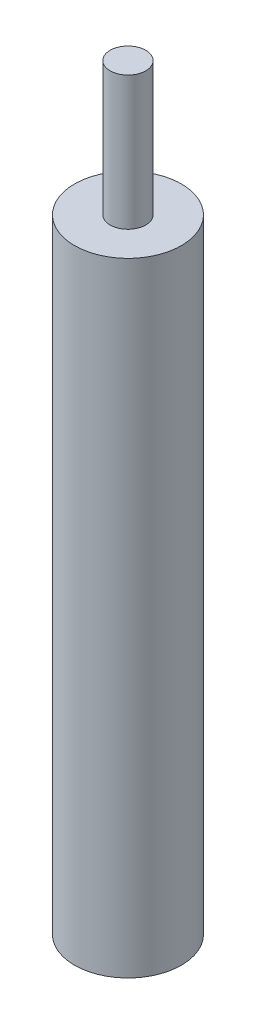
ISO-10303-21;
HEADER;
FILE_DESCRIPTION(('STEP AP214'),'2;1');
FILE_NAME('part.step','',(''),(''),'','','');
FILE_SCHEMA(('AUTOMOTIVE_DESIGN { 1 0 10303 214 1 1 1 1 }'));
ENDSEC;
DATA;
#1=APPLICATION_CONTEXT('core data for automotive mechanical design processes');
#2=APPLICATION_PROTOCOL_DEFINITION('international standard','automotive_design',2000,#1);
#3=PRODUCT_CONTEXT('',#1,'mechanical');
#4=PRODUCT('Part','Part','',(#3));
#5=PRODUCT_RELATED_PRODUCT_CATEGORY('part','',(#4));
#6=PRODUCT_DEFINITION_FORMATION('','',#4);
#7=PRODUCT_DEFINITION_CONTEXT('part definition',#1,'design');
#8=PRODUCT_DEFINITION('design','',#6,#7);
#9=PRODUCT_DEFINITION_SHAPE('','',#8);
#10=(LENGTH_UNIT() NAMED_UNIT(*) SI_UNIT(.MILLI.,.METRE.));
#11=(NAMED_UNIT(*) PLANE_ANGLE_UNIT() SI_UNIT($,.RADIAN.));
#12=(NAMED_UNIT(*) SI_UNIT($,.STERADIAN.) SOLID_ANGLE_UNIT());
#13=UNCERTAINTY_MEASURE_WITH_UNIT(LENGTH_MEASURE(1.E-05),#10,'distance_accuracy_value','');
#14=(GEOMETRIC_REPRESENTATION_CONTEXT(3) GLOBAL_UNCERTAINTY_ASSIGNED_CONTEXT((#13)) GLOBAL_UNIT_ASSIGNED_CONTEXT((#10,
#11,#12)) REPRESENTATION_CONTEXT('',''));
#15=CARTESIAN_POINT('',(0.,0.,0.));
#16=DIRECTION('',(0.,0.,1.));
#17=DIRECTION('',(1.,0.,0.));
#18=AXIS2_PLACEMENT_3D('',#15,#16,#17);
#19=CARTESIAN_POINT('',(0.,70.,0.));
#20=DIRECTION('',(0.,-1.,0.));
#21=DIRECTION('',(0.,0.,-1.));
#22=AXIS2_PLACEMENT_3D('',#19,#20,#21);
#23=CYLINDRICAL_SURFACE('',#22,6.);
#24=CARTESIAN_POINT('',(0.,70.,0.));
#25=DIRECTION('',(0.,1.,0.));
#26=DIRECTION('',(0.,0.,1.));
#27=AXIS2_PLACEMENT_3D('',#24,#25,#26);
#28=CIRCLE('',#27,6.);
#29=CARTESIAN_POINT('',(0.,70.,6.));
#30=VERTEX_POINT('',#29);
#31=EDGE_CURVE('E48',#30,#30,#28,.T.);
#32=ORIENTED_EDGE('',*,*,#31,.F.);
#33=EDGE_LOOP('',(#32));
#34=FACE_BOUND('',#33,.T.);
#35=CARTESIAN_POINT('',(0.,0.,0.));
#36=DIRECTION('',(0.,1.,0.));
#37=DIRECTION('',(0.,0.,1.));
#38=AXIS2_PLACEMENT_3D('',#35,#36,#37);
#39=CIRCLE('',#38,6.);
#40=CARTESIAN_POINT('',(0.,0.,6.));
#41=VERTEX_POINT('',#40);
#42=EDGE_CURVE('E42',#41,#41,#39,.T.);
#43=ORIENTED_EDGE('',*,*,#42,.T.);
#44=EDGE_LOOP('',(#43));
#45=FACE_BOUND('',#44,.T.);
#46=ADVANCED_FACE('F41',(#34,#45),#23,.T.);
#47=CARTESIAN_POINT('',(0.,70.,0.));
#48=DIRECTION('',(0.,1.,0.));
#49=DIRECTION('',(0.,0.,1.));
#50=AXIS2_PLACEMENT_3D('',#47,#48,#49);
#51=PLANE('',#50);
#52=CARTESIAN_POINT('',(0.,70.,0.));
#53=DIRECTION('',(0.,1.,0.));
#54=DIRECTION('',(0.,0.,1.));
#55=AXIS2_PLACEMENT_3D('',#52,#53,#54);
#56=CIRCLE('',#55,2.);
#57=CARTESIAN_POINT('',(0.,70.,2.));
#58=VERTEX_POINT('',#57);
#59=EDGE_CURVE('E10',#58,#58,#56,.T.);
#60=ORIENTED_EDGE('',*,*,#59,.F.);
#61=EDGE_LOOP('',(#60));
#62=FACE_BOUND('',#61,.T.);
#63=ORIENTED_EDGE('',*,*,#31,.T.);
#64=EDGE_LOOP('',(#63));
#65=FACE_BOUND('',#64,.T.);
#66=ADVANCED_FACE('F86',(#62,#65),#51,.T.);
#67=CARTESIAN_POINT('',(0.,0.,0.));
#68=DIRECTION('',(0.,1.,0.));
#69=DIRECTION('',(0.,0.,1.));
#70=AXIS2_PLACEMENT_3D('',#67,#68,#69);
#71=PLANE('',#70);
#72=CARTESIAN_POINT('',(-2.5,0.,0.));
#73=DIRECTION('',(0.,1.,0.));
#74=DIRECTION('',(0.,0.,1.));
#75=AXIS2_PLACEMENT_3D('',#72,#73,#74);
#76=CIRCLE('',#75,0.8);
#77=CARTESIAN_POINT('',(-2.5,0.,0.8));
#78=VERTEX_POINT('',#77);
#79=EDGE_CURVE('E56',#78,#78,#76,.T.);
#80=ORIENTED_EDGE('',*,*,#79,.T.);
#81=EDGE_LOOP('',(#80));
#82=FACE_BOUND('',#81,.T.);
#83=CARTESIAN_POINT('',(2.5,0.,0.));
#84=DIRECTION('',(0.,1.,0.));
#85=DIRECTION('',(0.,0.,1.));
#86=AXIS2_PLACEMENT_3D('',#83,#84,#85);
#87=CIRCLE('',#86,0.8);
#88=CARTESIAN_POINT('',(2.5,0.,0.8));
#89=VERTEX_POINT('',#88);
#90=EDGE_CURVE('E64',#89,#89,#87,.T.);
#91=ORIENTED_EDGE('',*,*,#90,.T.);
#92=EDGE_LOOP('',(#91));
#93=FACE_BOUND('',#92,.T.);
#94=ORIENTED_EDGE('',*,*,#42,.F.);
#95=EDGE_LOOP('',(#94));
#96=FACE_BOUND('',#95,.T.);
#97=ADVANCED_FACE('F91',(#82,#93,#96),#71,.F.);
#98=CARTESIAN_POINT('',(2.5,3.,0.));
#99=DIRECTION('',(0.,-1.,0.));
#100=DIRECTION('',(0.,0.,-1.));
#101=AXIS2_PLACEMENT_3D('',#98,#99,#100);
#102=CYLINDRICAL_SURFACE('',#101,0.8);
#103=CARTESIAN_POINT('',(2.5,3.,0.));
#104=DIRECTION('',(0.,1.,0.));
#105=DIRECTION('',(0.,0.,1.));
#106=AXIS2_PLACEMENT_3D('',#103,#104,#105);
#107=CIRCLE('',#106,0.8);
#108=CARTESIAN_POINT('',(2.5,3.,0.8));
#109=VERTEX_POINT('',#108);
#110=EDGE_CURVE('E63',#109,#109,#107,.T.);
#111=ORIENTED_EDGE('',*,*,#110,.T.);
#112=EDGE_LOOP('',(#111));
#113=FACE_BOUND('',#112,.T.);
#114=ORIENTED_EDGE('',*,*,#90,.F.);
#115=EDGE_LOOP('',(#114));
#116=FACE_BOUND('',#115,.T.);
#117=ADVANCED_FACE('F101',(#113,#116),#102,.F.);
#118=CARTESIAN_POINT('',(2.5,3.,0.));
#119=DIRECTION('',(0.,1.,0.));
#120=DIRECTION('',(0.,0.,1.));
#121=AXIS2_PLACEMENT_3D('',#118,#119,#120);
#122=PLANE('',#121);
#123=ORIENTED_EDGE('',*,*,#110,.F.);
#124=EDGE_LOOP('',(#123));
#125=FACE_BOUND('',#124,.T.);
#126=ADVANCED_FACE('F106',(#125),#122,.F.);
#127=CARTESIAN_POINT('',(-2.5,3.,0.));
#128=DIRECTION('',(0.,-1.,0.));
#129=DIRECTION('',(0.,0.,-1.));
#130=AXIS2_PLACEMENT_3D('',#127,#128,#129);
#131=CYLINDRICAL_SURFACE('',#130,0.8);
#132=CARTESIAN_POINT('',(-2.5,3.,0.));
#133=DIRECTION('',(0.,1.,0.));
#134=DIRECTION('',(0.,0.,1.));
#135=AXIS2_PLACEMENT_3D('',#132,#133,#134);
#136=CIRCLE('',#135,0.8);
#137=CARTESIAN_POINT('',(-2.5,3.,0.8));
#138=VERTEX_POINT('',#137);
#139=EDGE_CURVE('E57',#138,#138,#136,.T.);
#140=ORIENTED_EDGE('',*,*,#139,.T.);
#141=EDGE_LOOP('',(#140));
#142=FACE_BOUND('',#141,.T.);
#143=ORIENTED_EDGE('',*,*,#79,.F.);
#144=EDGE_LOOP('',(#143));
#145=FACE_BOUND('',#144,.T.);
#146=ADVANCED_FACE('F83',(#142,#145),#131,.F.);
#147=CARTESIAN_POINT('',(-2.5,3.,0.));
#148=DIRECTION('',(0.,1.,0.));
#149=DIRECTION('',(0.,0.,1.));
#150=AXIS2_PLACEMENT_3D('',#147,#148,#149);
#151=PLANE('',#150);
#152=ORIENTED_EDGE('',*,*,#139,.F.);
#153=EDGE_LOOP('',(#152));
#154=FACE_BOUND('',#153,.T.);
#155=ADVANCED_FACE('F77',(#154),#151,.F.);
#156=CARTESIAN_POINT('',(0.,85.,0.));
#157=DIRECTION('',(0.,-1.,0.));
#158=DIRECTION('',(0.,0.,-1.));
#159=AXIS2_PLACEMENT_3D('',#156,#157,#158);
#160=CYLINDRICAL_SURFACE('',#159,2.);
#161=CARTESIAN_POINT('',(0.,85.,0.));
#162=DIRECTION('',(0.,1.,0.));
#163=DIRECTION('',(0.,0.,1.));
#164=AXIS2_PLACEMENT_3D('',#161,#162,#163);
#165=CIRCLE('',#164,2.);
#166=CARTESIAN_POINT('',(0.,85.,2.));
#167=VERTEX_POINT('',#166);
#168=EDGE_CURVE('E54',#167,#167,#165,.T.);
#169=ORIENTED_EDGE('',*,*,#168,.F.);
#170=EDGE_LOOP('',(#169));
#171=FACE_BOUND('',#170,.T.);
#172=ORIENTED_EDGE('',*,*,#59,.T.);
#173=EDGE_LOOP('',(#172));
#174=FACE_BOUND('',#173,.T.);
#175=ADVANCED_FACE('F74',(#171,#174),#160,.T.);
#176=CARTESIAN_POINT('',(0.,85.,0.));
#177=DIRECTION('',(0.,1.,0.));
#178=DIRECTION('',(0.,0.,1.));
#179=AXIS2_PLACEMENT_3D('',#176,#177,#178);
#180=PLANE('',#179);
#181=ORIENTED_EDGE('',*,*,#168,.T.);
#182=EDGE_LOOP('',(#181));
#183=FACE_BOUND('',#182,.T.);
#184=ADVANCED_FACE('F75',(#183),#180,.T.);
#185=CLOSED_SHELL('',(#46,#66,#97,#117,#126,#146,#155,#175,#184));
#186=MANIFOLD_SOLID_BREP('B2',#185);
#187=ADVANCED_BREP_SHAPE_REPRESENTATION('',(#18,#186),#14);
#188=SHAPE_DEFINITION_REPRESENTATION(#9,#187);
ENDSEC;
END-ISO-10303-21;
